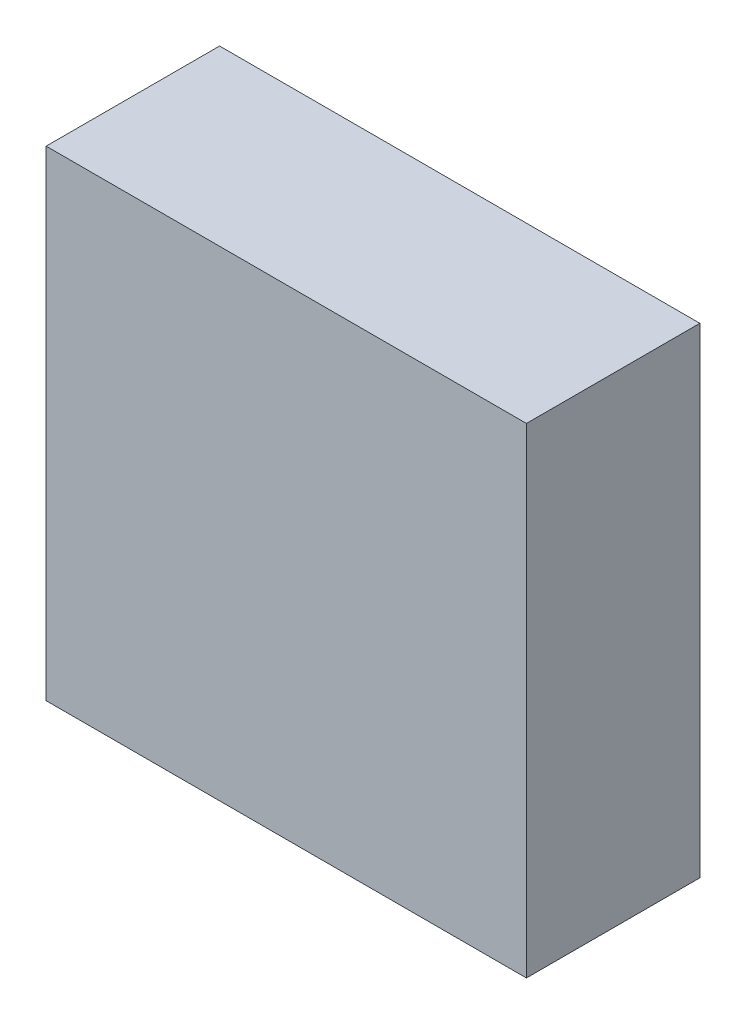
ISO-10303-21;
HEADER;
FILE_DESCRIPTION(('STEP AP214'),'2;1');
FILE_NAME('part.step','',(''),(''),'','','');
FILE_SCHEMA(('AUTOMOTIVE_DESIGN { 1 0 10303 214 1 1 1 1 }'));
ENDSEC;
DATA;
#1=APPLICATION_CONTEXT('core data for automotive mechanical design processes');
#2=APPLICATION_PROTOCOL_DEFINITION('international standard','automotive_design',2000,#1);
#3=PRODUCT_CONTEXT('',#1,'mechanical');
#4=PRODUCT('Part','Part','',(#3));
#5=PRODUCT_RELATED_PRODUCT_CATEGORY('part','',(#4));
#6=PRODUCT_DEFINITION_FORMATION('','',#4);
#7=PRODUCT_DEFINITION_CONTEXT('part definition',#1,'design');
#8=PRODUCT_DEFINITION('design','',#6,#7);
#9=PRODUCT_DEFINITION_SHAPE('','',#8);
#10=(LENGTH_UNIT() NAMED_UNIT(*) SI_UNIT(.MILLI.,.METRE.));
#11=(NAMED_UNIT(*) PLANE_ANGLE_UNIT() SI_UNIT($,.RADIAN.));
#12=(NAMED_UNIT(*) SI_UNIT($,.STERADIAN.) SOLID_ANGLE_UNIT());
#13=UNCERTAINTY_MEASURE_WITH_UNIT(LENGTH_MEASURE(1.E-05),#10,'distance_accuracy_value','');
#14=(GEOMETRIC_REPRESENTATION_CONTEXT(3) GLOBAL_UNCERTAINTY_ASSIGNED_CONTEXT((#13)) GLOBAL_UNIT_ASSIGNED_CONTEXT((#10,
#11,#12)) REPRESENTATION_CONTEXT('',''));
#15=CARTESIAN_POINT('',(0.,0.,0.));
#16=DIRECTION('',(0.,0.,1.));
#17=DIRECTION('',(1.,0.,0.));
#18=AXIS2_PLACEMENT_3D('',#15,#16,#17);
#19=CARTESIAN_POINT('',(9.01269049258807,24.2550345946876,2.76531730400001));
#20=CARTESIAN_POINT('',(9.01269049258807,24.2550345946876,1.98531581600001));
#21=CARTESIAN_POINT('',(11.1726892205881,24.2550345946876,2.76531730400001));
#22=CARTESIAN_POINT('',(11.1726892205881,24.2550345946876,1.98531581600001));
#23=(BOUNDED_SURFACE() B_SPLINE_SURFACE(1,1,((#19,#20),(#21,#22)),.UNSPECIFIED.,.F.,.F.,
.F.) B_SPLINE_SURFACE_WITH_KNOTS((2,2),(2,2),(-0.000179999894000003,0.00197999883400003),
(-0.000715001364,6.5000124E-05),
.UNSPECIFIED.) GEOMETRIC_REPRESENTATION_ITEM() RATIONAL_B_SPLINE_SURFACE(((1.,1.),(1.,1.))) REPRESENTATION_ITEM('') SURFACE());
#24=CARTESIAN_POINT('',(9.19269038658807,24.2550345946876,2.05031594000001));
#25=CARTESIAN_POINT('',(9.19269038658807,24.2550345946876,2.70031718000001));
#26=(BOUNDED_CURVE() B_SPLINE_CURVE(1,(#24,#25),.UNSPECIFIED.,.F.,
.F.) B_SPLINE_CURVE_WITH_KNOTS((2,2),(0.,0.00065000124),
.UNSPECIFIED.) CURVE() GEOMETRIC_REPRESENTATION_ITEM() RATIONAL_B_SPLINE_CURVE((1.,1.)) REPRESENTATION_ITEM(''));
#27=CARTESIAN_POINT('',(9.19269038658807,24.2550345946876,2.05031594000001));
#28=VERTEX_POINT('',#27);
#29=CARTESIAN_POINT('',(9.19269038658807,24.2550345946876,2.70031718000001));
#30=VERTEX_POINT('',#29);
#31=EDGE_CURVE('E59',#28,#30,#26,.T.);
#32=CARTESIAN_POINT('',(9.19269038658807,24.2550345946876,2.70031718000001));
#33=CARTESIAN_POINT('',(10.9926893265881,24.2550345946876,2.70031718000001));
#34=(BOUNDED_CURVE() B_SPLINE_CURVE(1,(#32,#33),.UNSPECIFIED.,.F.,
.F.) B_SPLINE_CURVE_WITH_KNOTS((2,2),(0.,0.00179999894000003),
.UNSPECIFIED.) CURVE() GEOMETRIC_REPRESENTATION_ITEM() RATIONAL_B_SPLINE_CURVE((1.,1.)) REPRESENTATION_ITEM(''));
#35=CARTESIAN_POINT('',(10.9926893265881,24.2550345946876,2.70031718000001));
#36=VERTEX_POINT('',#35);
#37=EDGE_CURVE('E62',#30,#36,#34,.T.);
#38=CARTESIAN_POINT('',(10.9926893265881,24.2550345946876,2.05031594000001));
#39=CARTESIAN_POINT('',(10.9926893265881,24.2550345946876,2.70031718000001));
#40=(BOUNDED_CURVE() B_SPLINE_CURVE(1,(#38,#39),.UNSPECIFIED.,.F.,
.F.) B_SPLINE_CURVE_WITH_KNOTS((2,2),(0.,0.00065000124),
.UNSPECIFIED.) CURVE() GEOMETRIC_REPRESENTATION_ITEM() RATIONAL_B_SPLINE_CURVE((1.,1.)) REPRESENTATION_ITEM(''));
#41=CARTESIAN_POINT('',(10.9926893265881,24.2550345946876,2.05031594000001));
#42=VERTEX_POINT('',#41);
#43=EDGE_CURVE('E11',#42,#36,#40,.T.);
#44=CARTESIAN_POINT('',(9.19269038658807,24.2550345946876,2.05031594000001));
#45=CARTESIAN_POINT('',(10.9926893265881,24.2550345946876,2.05031594000001));
#46=(BOUNDED_CURVE() B_SPLINE_CURVE(1,(#44,#45),.UNSPECIFIED.,.F.,
.F.) B_SPLINE_CURVE_WITH_KNOTS((2,2),(0.,0.00179999894000003),
.UNSPECIFIED.) CURVE() GEOMETRIC_REPRESENTATION_ITEM() RATIONAL_B_SPLINE_CURVE((1.,1.)) REPRESENTATION_ITEM(''));
#47=EDGE_CURVE('E65',#28,#42,#46,.T.);
#48=ORIENTED_EDGE('',*,*,#31,.T.);
#49=ORIENTED_EDGE('',*,*,#37,.T.);
#50=ORIENTED_EDGE('',*,*,#43,.F.);
#51=ORIENTED_EDGE('',*,*,#47,.F.);
#52=EDGE_LOOP('',(#48,#49,#50,#51));
#53=FACE_BOUND('',#52,.T.);
#54=ADVANCED_FACE('F17',(#53),#23,.T.);
#55=CARTESIAN_POINT('',(10.9926893265881,24.4350344886876,2.76531730400001));
#56=CARTESIAN_POINT('',(10.9926893265881,24.4350344886876,1.98531581600001));
#57=CARTESIAN_POINT('',(10.9926893265881,22.2750357606875,2.76531730400001));
#58=CARTESIAN_POINT('',(10.9926893265881,22.2750357606875,1.98531581600001));
#59=(BOUNDED_SURFACE() B_SPLINE_SURFACE(1,1,((#55,#56),(#57,#58)),.UNSPECIFIED.,.F.,.F.,
.F.) B_SPLINE_SURFACE_WITH_KNOTS((2,2),(2,2),(-0.00017999989400001,0.00197999883400011),
(-0.000715001364,6.5000124E-05),
.UNSPECIFIED.) GEOMETRIC_REPRESENTATION_ITEM() RATIONAL_B_SPLINE_SURFACE(((1.,1.),(1.,1.))) REPRESENTATION_ITEM('') SURFACE());
#60=CARTESIAN_POINT('',(10.9926893265881,24.2550345946876,2.70031718000001));
#61=CARTESIAN_POINT('',(10.9926893265881,22.4550356546875,2.70031718000001));
#62=(BOUNDED_CURVE() B_SPLINE_CURVE(1,(#60,#61),.UNSPECIFIED.,.F.,
.F.) B_SPLINE_CURVE_WITH_KNOTS((2,2),(0.,0.0017999989400001),
.UNSPECIFIED.) CURVE() GEOMETRIC_REPRESENTATION_ITEM() RATIONAL_B_SPLINE_CURVE((1.,1.)) REPRESENTATION_ITEM(''));
#63=CARTESIAN_POINT('',(10.9926893265881,22.4550356546875,2.70031718000001));
#64=VERTEX_POINT('',#63);
#65=EDGE_CURVE('E77',#36,#64,#62,.T.);
#66=CARTESIAN_POINT('',(10.9926893265881,22.4550356546875,2.05031594000001));
#67=CARTESIAN_POINT('',(10.9926893265881,22.4550356546875,2.70031718000001));
#68=(BOUNDED_CURVE() B_SPLINE_CURVE(1,(#66,#67),.UNSPECIFIED.,.F.,
.F.) B_SPLINE_CURVE_WITH_KNOTS((2,2),(0.,0.00065000124),
.UNSPECIFIED.) CURVE() GEOMETRIC_REPRESENTATION_ITEM() RATIONAL_B_SPLINE_CURVE((1.,1.)) REPRESENTATION_ITEM(''));
#69=CARTESIAN_POINT('',(10.9926893265881,22.4550356546875,2.05031594000001));
#70=VERTEX_POINT('',#69);
#71=EDGE_CURVE('E32',#70,#64,#68,.T.);
#72=CARTESIAN_POINT('',(10.9926893265881,24.2550345946876,2.05031594000001));
#73=CARTESIAN_POINT('',(10.9926893265881,22.4550356546875,2.05031594000001));
#74=(BOUNDED_CURVE() B_SPLINE_CURVE(1,(#72,#73),.UNSPECIFIED.,.F.,
.F.) B_SPLINE_CURVE_WITH_KNOTS((2,2),(0.,0.0017999989400001),
.UNSPECIFIED.) CURVE() GEOMETRIC_REPRESENTATION_ITEM() RATIONAL_B_SPLINE_CURVE((1.,1.)) REPRESENTATION_ITEM(''));
#75=EDGE_CURVE('E123',#42,#70,#74,.T.);
#76=ORIENTED_EDGE('',*,*,#43,.T.);
#77=ORIENTED_EDGE('',*,*,#65,.T.);
#78=ORIENTED_EDGE('',*,*,#71,.F.);
#79=ORIENTED_EDGE('',*,*,#75,.F.);
#80=EDGE_LOOP('',(#76,#77,#78,#79));
#81=FACE_BOUND('',#80,.T.);
#82=ADVANCED_FACE('F168',(#81),#59,.T.);
#83=CARTESIAN_POINT('',(11.1726892205881,22.4550356546875,2.76531730400001));
#84=CARTESIAN_POINT('',(11.1726892205881,22.4550356546875,1.98531581600001));
#85=CARTESIAN_POINT('',(9.01269049258807,22.4550356546875,2.76531730400001));
#86=CARTESIAN_POINT('',(9.01269049258806,22.4550356546875,1.98531581600001));
#87=(BOUNDED_SURFACE() B_SPLINE_SURFACE(1,1,((#83,#84),(#85,#86)),.UNSPECIFIED.,.F.,.F.,
.F.) B_SPLINE_SURFACE_WITH_KNOTS((2,2),(2,2),(-0.000179999894000003,0.00197999883400003),
(-0.000715001364,6.5000124E-05),
.UNSPECIFIED.) GEOMETRIC_REPRESENTATION_ITEM() RATIONAL_B_SPLINE_SURFACE(((1.,1.),(1.,1.))) REPRESENTATION_ITEM('') SURFACE());
#88=CARTESIAN_POINT('',(10.9926893265881,22.4550356546875,2.70031718000001));
#89=CARTESIAN_POINT('',(9.19269038658807,22.4550356546875,2.70031718000001));
#90=(BOUNDED_CURVE() B_SPLINE_CURVE(1,(#88,#89),.UNSPECIFIED.,.F.,
.F.) B_SPLINE_CURVE_WITH_KNOTS((2,2),(0.,0.00179999894000003),
.UNSPECIFIED.) CURVE() GEOMETRIC_REPRESENTATION_ITEM() RATIONAL_B_SPLINE_CURVE((1.,1.)) REPRESENTATION_ITEM(''));
#91=CARTESIAN_POINT('',(9.19269038658807,22.4550356546875,2.70031718000001));
#92=VERTEX_POINT('',#91);
#93=EDGE_CURVE('E23',#64,#92,#90,.T.);
#94=CARTESIAN_POINT('',(9.19269038658807,22.4550356546875,2.05031594000001));
#95=CARTESIAN_POINT('',(9.19269038658807,22.4550356546875,2.70031718000001));
#96=(BOUNDED_CURVE() B_SPLINE_CURVE(1,(#94,#95),.UNSPECIFIED.,.F.,
.F.) B_SPLINE_CURVE_WITH_KNOTS((2,2),(0.,0.00065000124),
.UNSPECIFIED.) CURVE() GEOMETRIC_REPRESENTATION_ITEM() RATIONAL_B_SPLINE_CURVE((1.,1.)) REPRESENTATION_ITEM(''));
#97=CARTESIAN_POINT('',(9.19269038658807,22.4550356546875,2.05031594000001));
#98=VERTEX_POINT('',#97);
#99=EDGE_CURVE('E40',#98,#92,#96,.T.);
#100=CARTESIAN_POINT('',(10.9926893265881,22.4550356546875,2.05031594000001));
#101=CARTESIAN_POINT('',(9.19269038658807,22.4550356546875,2.05031594000001));
#102=(BOUNDED_CURVE() B_SPLINE_CURVE(1,(#100,#101),.UNSPECIFIED.,.F.,
.F.) B_SPLINE_CURVE_WITH_KNOTS((2,2),(0.,0.00179999894000003),
.UNSPECIFIED.) CURVE() GEOMETRIC_REPRESENTATION_ITEM() RATIONAL_B_SPLINE_CURVE((1.,1.)) REPRESENTATION_ITEM(''));
#103=EDGE_CURVE('E108',#70,#98,#102,.T.);
#104=ORIENTED_EDGE('',*,*,#71,.T.);
#105=ORIENTED_EDGE('',*,*,#93,.T.);
#106=ORIENTED_EDGE('',*,*,#99,.F.);
#107=ORIENTED_EDGE('',*,*,#103,.F.);
#108=EDGE_LOOP('',(#104,#105,#106,#107));
#109=FACE_BOUND('',#108,.T.);
#110=ADVANCED_FACE('F19',(#109),#87,.T.);
#111=CARTESIAN_POINT('',(9.19269038658807,22.2750357606875,2.76531730400001));
#112=CARTESIAN_POINT('',(9.19269038658807,22.2750357606875,1.98531581600001));
#113=CARTESIAN_POINT('',(9.19269038658807,24.4350344886876,2.76531730400001));
#114=CARTESIAN_POINT('',(9.19269038658807,24.4350344886876,1.98531581600001));
#115=(BOUNDED_SURFACE() B_SPLINE_SURFACE(1,1,((#111,#112),(#113,#114)),.UNSPECIFIED.,.F.,.F.,
.F.) B_SPLINE_SURFACE_WITH_KNOTS((2,2),(2,2),(-0.00017999989400001,0.00197999883400011),
(-0.000715001364,6.5000124E-05),
.UNSPECIFIED.) GEOMETRIC_REPRESENTATION_ITEM() RATIONAL_B_SPLINE_SURFACE(((1.,1.),(1.,1.))) REPRESENTATION_ITEM('') SURFACE());
#116=CARTESIAN_POINT('',(9.19269038658807,22.4550356546875,2.70031718000001));
#117=CARTESIAN_POINT('',(9.19269038658807,24.2550345946876,2.70031718000001));
#118=(BOUNDED_CURVE() B_SPLINE_CURVE(1,(#116,#117),.UNSPECIFIED.,.F.,
.F.) B_SPLINE_CURVE_WITH_KNOTS((2,2),(0.,0.0017999989400001),
.UNSPECIFIED.) CURVE() GEOMETRIC_REPRESENTATION_ITEM() RATIONAL_B_SPLINE_CURVE((1.,1.)) REPRESENTATION_ITEM(''));
#119=EDGE_CURVE('E75',#92,#30,#118,.T.);
#120=CARTESIAN_POINT('',(9.19269038658807,22.4550356546875,2.05031594000001));
#121=CARTESIAN_POINT('',(9.19269038658807,24.2550345946876,2.05031594000001));
#122=(BOUNDED_CURVE() B_SPLINE_CURVE(1,(#120,#121),.UNSPECIFIED.,.F.,
.F.) B_SPLINE_CURVE_WITH_KNOTS((2,2),(0.,0.0017999989400001),
.UNSPECIFIED.) CURVE() GEOMETRIC_REPRESENTATION_ITEM() RATIONAL_B_SPLINE_CURVE((1.,1.)) REPRESENTATION_ITEM(''));
#123=EDGE_CURVE('E101',#98,#28,#122,.T.);
#124=ORIENTED_EDGE('',*,*,#99,.T.);
#125=ORIENTED_EDGE('',*,*,#119,.T.);
#126=ORIENTED_EDGE('',*,*,#31,.F.);
#127=ORIENTED_EDGE('',*,*,#123,.F.);
#128=EDGE_LOOP('',(#124,#125,#126,#127));
#129=FACE_BOUND('',#128,.T.);
#130=ADVANCED_FACE('F80',(#129),#115,.T.);
#131=CARTESIAN_POINT('',(11.1726892205881,22.2750357606875,2.05031594000001));
#132=CARTESIAN_POINT('',(11.1726892205881,24.4350344886876,2.05031594000001));
#133=CARTESIAN_POINT('',(9.01269049258807,22.2750357606875,2.05031594000001));
#134=CARTESIAN_POINT('',(9.01269049258807,24.4350344886876,2.05031594000001));
#135=(BOUNDED_SURFACE() B_SPLINE_SURFACE(1,1,((#131,#132),(#133,#134)),.UNSPECIFIED.,.F.,.F.,
.F.) B_SPLINE_SURFACE_WITH_KNOTS((2,2),(2,2),(-0.000179999894000003,0.00197999883400003),
(-0.00197999883400011,0.00017999989400001),
.UNSPECIFIED.) GEOMETRIC_REPRESENTATION_ITEM() RATIONAL_B_SPLINE_SURFACE(((1.,1.),(1.,1.))) REPRESENTATION_ITEM('') SURFACE());
#136=ORIENTED_EDGE('',*,*,#47,.T.);
#137=ORIENTED_EDGE('',*,*,#75,.T.);
#138=ORIENTED_EDGE('',*,*,#103,.T.);
#139=ORIENTED_EDGE('',*,*,#123,.T.);
#140=EDGE_LOOP('',(#136,#137,#138,#139));
#141=FACE_BOUND('',#140,.T.);
#142=ADVANCED_FACE('F165',(#141),#135,.T.);
#143=CARTESIAN_POINT('',(9.01269049258807,22.2750357606875,2.70031718000001));
#144=CARTESIAN_POINT('',(9.01269049258807,24.4350344886876,2.70031718000001));
#145=CARTESIAN_POINT('',(11.1726892205881,22.2750357606875,2.70031718000001));
#146=CARTESIAN_POINT('',(11.1726892205881,24.4350344886876,2.70031718000001));
#147=(BOUNDED_SURFACE() B_SPLINE_SURFACE(1,1,((#143,#144),(#145,#146)),.UNSPECIFIED.,.F.,.F.,
.F.) B_SPLINE_SURFACE_WITH_KNOTS((2,2),(2,2),(-0.000179999894000003,0.00197999883400003),
(-0.00197999883400011,0.00017999989400001),
.UNSPECIFIED.) GEOMETRIC_REPRESENTATION_ITEM() RATIONAL_B_SPLINE_SURFACE(((1.,1.),(1.,1.))) REPRESENTATION_ITEM('') SURFACE());
#148=ORIENTED_EDGE('',*,*,#119,.F.);
#149=ORIENTED_EDGE('',*,*,#93,.F.);
#150=ORIENTED_EDGE('',*,*,#65,.F.);
#151=ORIENTED_EDGE('',*,*,#37,.F.);
#152=EDGE_LOOP('',(#148,#149,#150,#151));
#153=FACE_BOUND('',#152,.T.);
#154=ADVANCED_FACE('F73',(#153),#147,.T.);
#155=CLOSED_SHELL('',(#54,#82,#110,#130,#142,#154));
#156=MANIFOLD_SOLID_BREP('B1',#155);
#157=ADVANCED_BREP_SHAPE_REPRESENTATION('',(#18,#156),#14);
#158=SHAPE_DEFINITION_REPRESENTATION(#9,#157);
ENDSEC;
END-ISO-10303-21;
